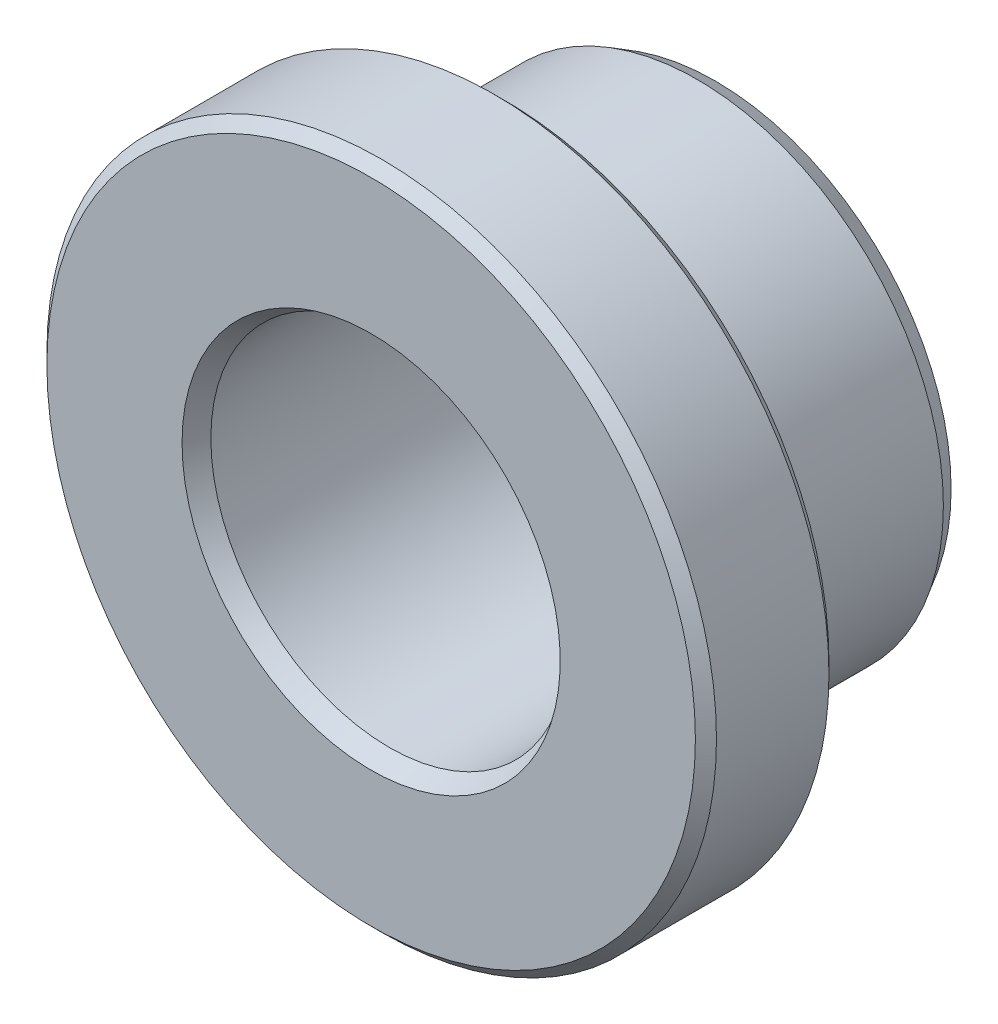
ISO-10303-21;
HEADER;
FILE_DESCRIPTION(('STEP AP214'),'2;1');
FILE_NAME('part.step','',(''),(''),'','','');
FILE_SCHEMA(('AUTOMOTIVE_DESIGN { 1 0 10303 214 1 1 1 1 }'));
ENDSEC;
DATA;
#1=APPLICATION_CONTEXT('core data for automotive mechanical design processes');
#2=APPLICATION_PROTOCOL_DEFINITION('international standard','automotive_design',2000,#1);
#3=PRODUCT_CONTEXT('',#1,'mechanical');
#4=PRODUCT('Part','Part','',(#3));
#5=PRODUCT_RELATED_PRODUCT_CATEGORY('part','',(#4));
#6=PRODUCT_DEFINITION_FORMATION('','',#4);
#7=PRODUCT_DEFINITION_CONTEXT('part definition',#1,'design');
#8=PRODUCT_DEFINITION('design','',#6,#7);
#9=PRODUCT_DEFINITION_SHAPE('','',#8);
#10=(LENGTH_UNIT() NAMED_UNIT(*) SI_UNIT(.MILLI.,.METRE.));
#11=(NAMED_UNIT(*) PLANE_ANGLE_UNIT() SI_UNIT($,.RADIAN.));
#12=(NAMED_UNIT(*) SI_UNIT($,.STERADIAN.) SOLID_ANGLE_UNIT());
#13=UNCERTAINTY_MEASURE_WITH_UNIT(LENGTH_MEASURE(1.E-05),#10,'distance_accuracy_value','');
#14=(GEOMETRIC_REPRESENTATION_CONTEXT(3) GLOBAL_UNCERTAINTY_ASSIGNED_CONTEXT((#13)) GLOBAL_UNIT_ASSIGNED_CONTEXT((#10,
#11,#12)) REPRESENTATION_CONTEXT('',''));
#15=CARTESIAN_POINT('',(0.,0.,0.));
#16=DIRECTION('',(0.,0.,1.));
#17=DIRECTION('',(1.,0.,0.));
#18=AXIS2_PLACEMENT_3D('',#15,#16,#17);
#19=CARTESIAN_POINT('',(0.,12.7,0.));
#20=DIRECTION('',(0.,0.,-1.));
#21=DIRECTION('',(-1.,0.,0.));
#22=AXIS2_PLACEMENT_3D('',#19,#20,#21);
#23=PLANE('',#22);
#24=CARTESIAN_POINT('',(0.,0.,0.));
#25=DIRECTION('',(0.,0.,-1.));
#26=DIRECTION('',(-1.,0.,0.));
#27=AXIS2_PLACEMENT_3D('',#24,#25,#26);
#28=CIRCLE('',#27,23.0625);
#29=CARTESIAN_POINT('',(-23.0625,0.,0.));
#30=VERTEX_POINT('',#29);
#31=EDGE_CURVE('E10',#30,#30,#28,.F.);
#32=ORIENTED_EDGE('',*,*,#31,.T.);
#33=EDGE_LOOP('',(#32));
#34=FACE_BOUND('',#33,.T.);
#35=CARTESIAN_POINT('',(0.,0.,0.));
#36=DIRECTION('',(0.,0.,-1.));
#37=DIRECTION('',(-1.,0.,0.));
#38=AXIS2_PLACEMENT_3D('',#35,#36,#37);
#39=CIRCLE('',#38,13.45);
#40=CARTESIAN_POINT('',(-13.45,0.,0.));
#41=VERTEX_POINT('',#40);
#42=EDGE_CURVE('E61',#41,#41,#39,.T.);
#43=ORIENTED_EDGE('',*,*,#42,.T.);
#44=EDGE_LOOP('',(#43));
#45=FACE_BOUND('',#44,.T.);
#46=ADVANCED_FACE('F32',(#34,#45),#23,.F.);
#47=CARTESIAN_POINT('',(0.,0.,0.));
#48=DIRECTION('',(0.,0.,1.));
#49=DIRECTION('',(1.,0.,0.));
#50=AXIS2_PLACEMENT_3D('',#47,#48,#49);
#51=CYLINDRICAL_SURFACE('',#50,23.8125);
#52=CARTESIAN_POINT('',(0.,0.,-8.74999999999999));
#53=DIRECTION('',(0.,0.,1.));
#54=DIRECTION('',(1.,0.,0.));
#55=AXIS2_PLACEMENT_3D('',#52,#53,#54);
#56=CIRCLE('',#55,23.8125);
#57=CARTESIAN_POINT('',(23.8125,0.,-8.74999999999999));
#58=VERTEX_POINT('',#57);
#59=EDGE_CURVE('E43',#58,#58,#56,.T.);
#60=ORIENTED_EDGE('',*,*,#59,.T.);
#61=EDGE_LOOP('',(#60));
#62=FACE_BOUND('',#61,.T.);
#63=CARTESIAN_POINT('',(0.,0.,-0.750000000000011));
#64=DIRECTION('',(0.,0.,-1.));
#65=DIRECTION('',(-1.,0.,0.));
#66=AXIS2_PLACEMENT_3D('',#63,#64,#65);
#67=CIRCLE('',#66,23.8125);
#68=CARTESIAN_POINT('',(-23.8125,0.,-0.750000000000011));
#69=VERTEX_POINT('',#68);
#70=EDGE_CURVE('E47',#69,#69,#67,.T.);
#71=ORIENTED_EDGE('',*,*,#70,.T.);
#72=EDGE_LOOP('',(#71));
#73=FACE_BOUND('',#72,.T.);
#74=ADVANCED_FACE('F88',(#62,#73),#51,.T.);
#75=CARTESIAN_POINT('',(0.,23.8125,-9.5));
#76=DIRECTION('',(0.,0.,1.));
#77=DIRECTION('',(1.,0.,0.));
#78=AXIS2_PLACEMENT_3D('',#75,#76,#77);
#79=PLANE('',#78);
#80=CARTESIAN_POINT('',(0.,0.,-9.5));
#81=DIRECTION('',(0.,0.,1.));
#82=DIRECTION('',(1.,0.,0.));
#83=AXIS2_PLACEMENT_3D('',#80,#81,#82);
#84=CIRCLE('',#83,23.0625);
#85=CARTESIAN_POINT('',(23.0625,0.,-9.5));
#86=VERTEX_POINT('',#85);
#87=EDGE_CURVE('E39',#86,#86,#84,.F.);
#88=ORIENTED_EDGE('',*,*,#87,.T.);
#89=EDGE_LOOP('',(#88));
#90=FACE_BOUND('',#89,.T.);
#91=CARTESIAN_POINT('',(0.,0.,-9.5));
#92=DIRECTION('',(0.,0.,1.));
#93=DIRECTION('',(1.,0.,0.));
#94=AXIS2_PLACEMENT_3D('',#91,#92,#93);
#95=CIRCLE('',#94,17.5);
#96=CARTESIAN_POINT('',(17.5,0.,-9.5));
#97=VERTEX_POINT('',#96);
#98=EDGE_CURVE('E70',#97,#97,#95,.T.);
#99=ORIENTED_EDGE('',*,*,#98,.T.);
#100=EDGE_LOOP('',(#99));
#101=FACE_BOUND('',#100,.T.);
#102=ADVANCED_FACE('F74',(#90,#101),#79,.F.);
#103=CARTESIAN_POINT('',(0.,0.,0.));
#104=DIRECTION('',(0.,0.,1.));
#105=DIRECTION('',(1.,0.,0.));
#106=AXIS2_PLACEMENT_3D('',#103,#104,#105);
#107=CYLINDRICAL_SURFACE('',#106,17.5);
#108=CARTESIAN_POINT('',(0.,0.,-23.2009618943233));
#109=DIRECTION('',(0.,0.,1.));
#110=DIRECTION('',(1.,0.,0.));
#111=AXIS2_PLACEMENT_3D('',#108,#109,#110);
#112=CIRCLE('',#111,17.5);
#113=CARTESIAN_POINT('',(17.5,0.,-23.2009618943233));
#114=VERTEX_POINT('',#113);
#115=EDGE_CURVE('E52',#114,#114,#112,.T.);
#116=ORIENTED_EDGE('',*,*,#115,.T.);
#117=EDGE_LOOP('',(#116));
#118=FACE_BOUND('',#117,.T.);
#119=ORIENTED_EDGE('',*,*,#98,.F.);
#120=EDGE_LOOP('',(#119));
#121=FACE_BOUND('',#120,.T.);
#122=ADVANCED_FACE('F76',(#118,#121),#107,.T.);
#123=CARTESIAN_POINT('',(0.,17.5,-24.5));
#124=DIRECTION('',(0.,0.,1.));
#125=DIRECTION('',(1.,0.,0.));
#126=AXIS2_PLACEMENT_3D('',#123,#124,#125);
#127=PLANE('',#126);
#128=CARTESIAN_POINT('',(0.,0.,-24.5));
#129=DIRECTION('',(0.,0.,1.));
#130=DIRECTION('',(1.,0.,0.));
#131=AXIS2_PLACEMENT_3D('',#128,#129,#130);
#132=CIRCLE('',#131,13.45);
#133=CARTESIAN_POINT('',(13.45,0.,-24.5));
#134=VERTEX_POINT('',#133);
#135=EDGE_CURVE('E55',#134,#134,#132,.T.);
#136=ORIENTED_EDGE('',*,*,#135,.T.);
#137=EDGE_LOOP('',(#136));
#138=FACE_BOUND('',#137,.T.);
#139=CARTESIAN_POINT('',(0.,0.,-24.5));
#140=DIRECTION('',(0.,0.,1.));
#141=DIRECTION('',(1.,0.,0.));
#142=AXIS2_PLACEMENT_3D('',#139,#140,#141);
#143=CIRCLE('',#142,16.75);
#144=CARTESIAN_POINT('',(16.75,0.,-24.5));
#145=VERTEX_POINT('',#144);
#146=EDGE_CURVE('E58',#145,#145,#143,.F.);
#147=ORIENTED_EDGE('',*,*,#146,.T.);
#148=EDGE_LOOP('',(#147));
#149=FACE_BOUND('',#148,.T.);
#150=ADVANCED_FACE('F78',(#138,#149),#127,.F.);
#151=CARTESIAN_POINT('',(0.,0.,0.));
#152=DIRECTION('',(0.,0.,1.));
#153=DIRECTION('',(1.,0.,0.));
#154=AXIS2_PLACEMENT_3D('',#151,#152,#153);
#155=CYLINDRICAL_SURFACE('',#154,12.7);
#156=CARTESIAN_POINT('',(0.,0.,-1.29903810567666));
#157=DIRECTION('',(0.,0.,-1.));
#158=DIRECTION('',(-1.,0.,0.));
#159=AXIS2_PLACEMENT_3D('',#156,#157,#158);
#160=CIRCLE('',#159,12.7);
#161=CARTESIAN_POINT('',(-12.7,0.,-1.29903810567666));
#162=VERTEX_POINT('',#161);
#163=EDGE_CURVE('E64',#162,#162,#160,.F.);
#164=ORIENTED_EDGE('',*,*,#163,.T.);
#165=EDGE_LOOP('',(#164));
#166=FACE_BOUND('',#165,.T.);
#167=CARTESIAN_POINT('',(0.,0.,-23.2009618943233));
#168=DIRECTION('',(0.,0.,1.));
#169=DIRECTION('',(1.,0.,0.));
#170=AXIS2_PLACEMENT_3D('',#167,#168,#169);
#171=CIRCLE('',#170,12.7);
#172=CARTESIAN_POINT('',(12.7,0.,-23.2009618943233));
#173=VERTEX_POINT('',#172);
#174=EDGE_CURVE('E67',#173,#173,#171,.F.);
#175=ORIENTED_EDGE('',*,*,#174,.T.);
#176=EDGE_LOOP('',(#175));
#177=FACE_BOUND('',#176,.T.);
#178=ADVANCED_FACE('F85',(#166,#177),#155,.F.);
#179=CARTESIAN_POINT('',(0.,0.,-1.29903810567666));
#180=DIRECTION('',(0.,0.,1.));
#181=DIRECTION('',(1.,0.,0.));
#182=AXIS2_PLACEMENT_3D('',#179,#180,#181);
#183=CONICAL_SURFACE('',#182,12.7,0.5235987755983);
#184=ORIENTED_EDGE('',*,*,#42,.F.);
#185=EDGE_LOOP('',(#184));
#186=FACE_BOUND('',#185,.T.);
#187=ORIENTED_EDGE('',*,*,#163,.F.);
#188=EDGE_LOOP('',(#187));
#189=FACE_BOUND('',#188,.T.);
#190=ADVANCED_FACE('F99',(#186,#189),#183,.F.);
#191=CARTESIAN_POINT('',(0.,0.,-24.5));
#192=DIRECTION('',(0.,0.,-1.));
#193=DIRECTION('',(-1.,0.,0.));
#194=AXIS2_PLACEMENT_3D('',#191,#192,#193);
#195=CONICAL_SURFACE('',#194,13.45,0.523598775598297);
#196=ORIENTED_EDGE('',*,*,#174,.F.);
#197=EDGE_LOOP('',(#196));
#198=FACE_BOUND('',#197,.T.);
#199=ORIENTED_EDGE('',*,*,#135,.F.);
#200=EDGE_LOOP('',(#199));
#201=FACE_BOUND('',#200,.T.);
#202=ADVANCED_FACE('F102',(#198,#201),#195,.F.);
#203=CARTESIAN_POINT('',(0.,0.,-23.2009618943233));
#204=DIRECTION('',(0.,0.,1.));
#205=DIRECTION('',(1.,0.,0.));
#206=AXIS2_PLACEMENT_3D('',#203,#204,#205);
#207=CONICAL_SURFACE('',#206,17.5,0.5235987755983);
#208=CARTESIAN_POINT('',(16.75,0.,-24.5));
#209=CARTESIAN_POINT('',(16.7578125,0.,-24.4864683530659));
#210=CARTESIAN_POINT('',(16.765625,0.,-24.4729367061317));
#211=CARTESIAN_POINT('',(16.78125,0.,-24.4458734122635));
#212=CARTESIAN_POINT('',(16.7890625,0.,-24.4323417653293));
#213=CARTESIAN_POINT('',(16.8046875,0.,-24.4052784714611));
#214=CARTESIAN_POINT('',(16.8125,0.,-24.3917468245269));
#215=CARTESIAN_POINT('',(16.828125,0.,-24.3646835306587));
#216=CARTESIAN_POINT('',(16.8359375,0.,-24.3511518837246));
#217=CARTESIAN_POINT('',(16.8515625,0.,-24.3240885898563));
#218=CARTESIAN_POINT('',(16.859375,0.,-24.3105569429222));
#219=CARTESIAN_POINT('',(16.875,0.,-24.2834936490539));
#220=CARTESIAN_POINT('',(16.8828125,0.,-24.2699620021198));
#221=CARTESIAN_POINT('',(16.8984375,0.,-24.2428987082515));
#222=CARTESIAN_POINT('',(16.90625,0.,-24.2293670613174));
#223=CARTESIAN_POINT('',(16.921875,0.,-24.2023037674491));
#224=CARTESIAN_POINT('',(16.9296875,0.,-24.188772120515));
#225=CARTESIAN_POINT('',(16.9453125,0.,-24.1617088266467));
#226=CARTESIAN_POINT('',(16.953125,0.,-24.1481771797126));
#227=CARTESIAN_POINT('',(16.96875,0.,-24.1211138858443));
#228=CARTESIAN_POINT('',(16.9765625,0.,-24.1075822389102));
#229=CARTESIAN_POINT('',(16.9921875,0.,-24.0805189450419));
#230=CARTESIAN_POINT('',(17.,0.,-24.0669872981078));
#231=CARTESIAN_POINT('',(17.015625,0.,-24.0399240042395));
#232=CARTESIAN_POINT('',(17.0234375,0.,-24.0263923573054));
#233=CARTESIAN_POINT('',(17.0390625,0.,-23.9993290634371));
#234=CARTESIAN_POINT('',(17.046875,0.,-23.985797416503));
#235=CARTESIAN_POINT('',(17.0625,0.,-23.9587341226347));
#236=CARTESIAN_POINT('',(17.0703125,0.,-23.9452024757006));
#237=CARTESIAN_POINT('',(17.0859375,0.,-23.9181391818323));
#238=CARTESIAN_POINT('',(17.09375,0.,-23.9046075348982));
#239=CARTESIAN_POINT('',(17.109375,0.,-23.8775442410299));
#240=CARTESIAN_POINT('',(17.1171875,0.,-23.8640125940958));
#241=CARTESIAN_POINT('',(17.1328125,0.,-23.8369493002275));
#242=CARTESIAN_POINT('',(17.140625,0.,-23.8234176532934));
#243=CARTESIAN_POINT('',(17.15625,0.,-23.7963543594251));
#244=CARTESIAN_POINT('',(17.1640625,0.,-23.782822712491));
#245=CARTESIAN_POINT('',(17.1796875,0.,-23.7557594186228));
#246=CARTESIAN_POINT('',(17.1875,0.,-23.7422277716886));
#247=CARTESIAN_POINT('',(17.203125,0.,-23.7151644778204));
#248=CARTESIAN_POINT('',(17.2109375,0.,-23.7016328308862));
#249=CARTESIAN_POINT('',(17.2265625,0.,-23.674569537018));
#250=CARTESIAN_POINT('',(17.234375,0.,-23.6610378900838));
#251=CARTESIAN_POINT('',(17.25,0.,-23.6339745962156));
#252=CARTESIAN_POINT('',(17.2578125,0.,-23.6204429492814));
#253=CARTESIAN_POINT('',(17.2734375,0.,-23.5933796554132));
#254=CARTESIAN_POINT('',(17.28125,0.,-23.579848008479));
#255=CARTESIAN_POINT('',(17.296875,0.,-23.5527847146108));
#256=CARTESIAN_POINT('',(17.3046875,0.,-23.5392530676766));
#257=CARTESIAN_POINT('',(17.3203125,0.,-23.5121897738084));
#258=CARTESIAN_POINT('',(17.328125,0.,-23.4986581268742));
#259=CARTESIAN_POINT('',(17.34375,0.,-23.471594833006));
#260=CARTESIAN_POINT('',(17.3515625,0.,-23.4580631860719));
#261=CARTESIAN_POINT('',(17.3671875,0.,-23.4309998922036));
#262=CARTESIAN_POINT('',(17.375,0.,-23.4174682452695));
#263=CARTESIAN_POINT('',(17.390625,0.,-23.3904049514012));
#264=CARTESIAN_POINT('',(17.3984375,0.,-23.3768733044671));
#265=CARTESIAN_POINT('',(17.4140625,0.,-23.3498100105988));
#266=CARTESIAN_POINT('',(17.421875,0.,-23.3362783636647));
#267=CARTESIAN_POINT('',(17.4375,0.,-23.3092150697964));
#268=CARTESIAN_POINT('',(17.4453125,0.,-23.2956834228623));
#269=CARTESIAN_POINT('',(17.4609375,0.,-23.268620128994));
#270=CARTESIAN_POINT('',(17.46875,0.,-23.2550884820599));
#271=CARTESIAN_POINT('',(17.484375,0.,-23.2280251881916));
#272=CARTESIAN_POINT('',(17.4921875,0.,-23.2144935412575));
#273=CARTESIAN_POINT('',(17.5,0.,-23.2009618943233));
#274=B_SPLINE_CURVE_WITH_KNOTS('',3,(#208,#209,#210,#211,#212,#213,#214,#215,#216,#217,#218,
#219,#220,#221,#222,#223,#224,#225,#226,#227,#228,#229,#230,#231,#232,#233,#234,#235,#236,#237,
#238,#239,#240,#241,#242,#243,#244,#245,#246,#247,#248,#249,#250,#251,#252,#253,#254,#255,#256,
#257,#258,#259,#260,#261,#262,#263,#264,#265,#266,#267,#268,#269,#270,#271,#272,#273),
.UNSPECIFIED.,.F.,.F.,(4,2,2,2,2,2,2,2,2,2,2,2,2,2,2,2,2,2,2,2,2,2,2,2,2,2,2,2,2,2,2,2,4),(0.,
0.0468749999999989,0.0937499999999995,0.140625,0.187500000000001,0.234375,0.28125,
0.328125000000001,0.375000000000001,0.421875,0.468750000000001,0.515625000000002,
0.562500000000002,0.609375000000001,0.656250000000002,0.703125000000002,0.75,0.796874999999999,
0.843749999999999,0.890625,0.9375,0.984374999999999,1.03125,1.078125,1.125,1.171875,1.21875,
1.265625,1.3125,1.359375,1.40625,1.453125,1.5),.UNSPECIFIED.);
#275=EDGE_CURVE('BSEAM106',#145,#114,#274,.T.);
#276=ORIENTED_EDGE('',*,*,#146,.F.);
#277=ORIENTED_EDGE('',*,*,#115,.F.);
#278=ORIENTED_EDGE('',*,*,#275,.T.);
#279=ORIENTED_EDGE('',*,*,#275,.F.);
#280=EDGE_LOOP('',(#276,#278,#277,#279));
#281=FACE_BOUND('',#280,.T.);
#282=ADVANCED_FACE('F106',(#281),#207,.T.);
#283=CARTESIAN_POINT('',(0.,0.,-8.74999999999999));
#284=DIRECTION('',(0.,0.,1.));
#285=DIRECTION('',(1.,0.,0.));
#286=AXIS2_PLACEMENT_3D('',#283,#284,#285);
#287=CONICAL_SURFACE('',#286,23.8125,0.785398163397446);
#288=ORIENTED_EDGE('',*,*,#87,.F.);
#289=EDGE_LOOP('',(#288));
#290=FACE_BOUND('',#289,.T.);
#291=ORIENTED_EDGE('',*,*,#59,.F.);
#292=EDGE_LOOP('',(#291));
#293=FACE_BOUND('',#292,.T.);
#294=ADVANCED_FACE('F109',(#290,#293),#287,.T.);
#295=CARTESIAN_POINT('',(0.,0.,0.));
#296=DIRECTION('',(0.,0.,-1.));
#297=DIRECTION('',(-1.,0.,0.));
#298=AXIS2_PLACEMENT_3D('',#295,#296,#297);
#299=CONICAL_SURFACE('',#298,23.0625,0.785398163397441);
#300=ORIENTED_EDGE('',*,*,#70,.F.);
#301=EDGE_LOOP('',(#300));
#302=FACE_BOUND('',#301,.T.);
#303=ORIENTED_EDGE('',*,*,#31,.F.);
#304=EDGE_LOOP('',(#303));
#305=FACE_BOUND('',#304,.T.);
#306=ADVANCED_FACE('F34',(#302,#305),#299,.T.);
#307=CLOSED_SHELL('',(#46,#74,#102,#122,#150,#178,#190,#202,#282,#294,#306));
#308=MANIFOLD_SOLID_BREP('B2',#307);
#309=ADVANCED_BREP_SHAPE_REPRESENTATION('',(#18,#308),#14);
#310=SHAPE_DEFINITION_REPRESENTATION(#9,#309);
ENDSEC;
END-ISO-10303-21;
